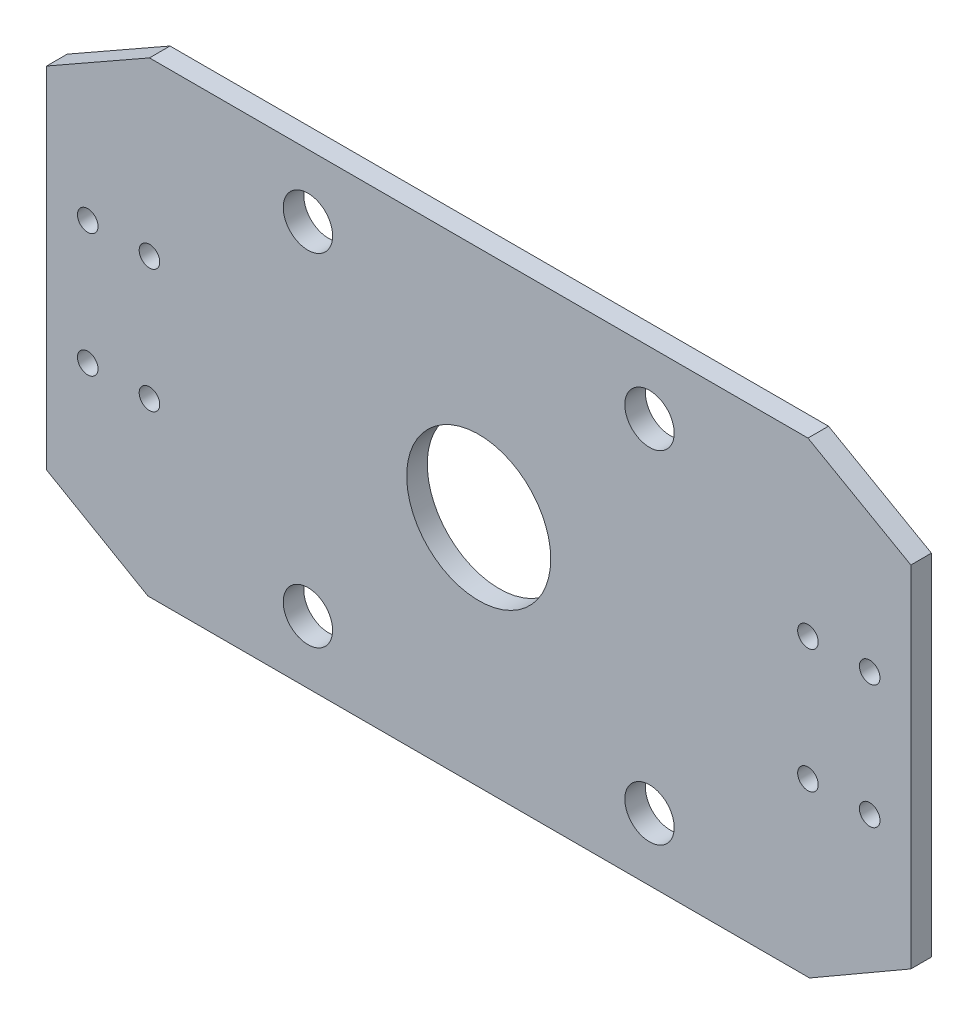
ISO-10303-21;
HEADER;
FILE_DESCRIPTION(('STEP AP214'),'2;1');
FILE_NAME('part.step','',(''),(''),'','','');
FILE_SCHEMA(('AUTOMOTIVE_DESIGN { 1 0 10303 214 1 1 1 1 }'));
ENDSEC;
DATA;
#1=APPLICATION_CONTEXT('core data for automotive mechanical design processes');
#2=APPLICATION_PROTOCOL_DEFINITION('international standard','automotive_design',2000,#1);
#3=PRODUCT_CONTEXT('',#1,'mechanical');
#4=PRODUCT('Part','Part','',(#3));
#5=PRODUCT_RELATED_PRODUCT_CATEGORY('part','',(#4));
#6=PRODUCT_DEFINITION_FORMATION('','',#4);
#7=PRODUCT_DEFINITION_CONTEXT('part definition',#1,'design');
#8=PRODUCT_DEFINITION('design','',#6,#7);
#9=PRODUCT_DEFINITION_SHAPE('','',#8);
#10=(LENGTH_UNIT() NAMED_UNIT(*) SI_UNIT(.MILLI.,.METRE.));
#11=(NAMED_UNIT(*) PLANE_ANGLE_UNIT() SI_UNIT($,.RADIAN.));
#12=(NAMED_UNIT(*) SI_UNIT($,.STERADIAN.) SOLID_ANGLE_UNIT());
#13=UNCERTAINTY_MEASURE_WITH_UNIT(LENGTH_MEASURE(1.E-05),#10,'distance_accuracy_value','');
#14=(GEOMETRIC_REPRESENTATION_CONTEXT(3) GLOBAL_UNCERTAINTY_ASSIGNED_CONTEXT((#13)) GLOBAL_UNIT_ASSIGNED_CONTEXT((#10,
#11,#12)) REPRESENTATION_CONTEXT('',''));
#15=CARTESIAN_POINT('',(0.,0.,0.));
#16=DIRECTION('',(0.,0.,1.));
#17=DIRECTION('',(1.,0.,0.));
#18=AXIS2_PLACEMENT_3D('',#15,#16,#17);
#19=CARTESIAN_POINT('',(0.,0.,5.));
#20=DIRECTION('',(0.,0.,1.));
#21=DIRECTION('',(1.,0.,0.));
#22=AXIS2_PLACEMENT_3D('',#19,#20,#21);
#23=PLANE('',#22);
#24=CARTESIAN_POINT('',(41.5000000000002,-42.4048530262646,5.));
#25=DIRECTION('',(0.,0.,1.));
#26=DIRECTION('',(1.,0.,0.));
#27=AXIS2_PLACEMENT_3D('',#24,#25,#26);
#28=CIRCLE('',#27,5.99999999999999);
#29=CARTESIAN_POINT('',(47.5000000000002,-42.4048530262646,5.));
#30=VERTEX_POINT('',#29);
#31=EDGE_CURVE('E242',#30,#30,#28,.T.);
#32=ORIENTED_EDGE('',*,*,#31,.F.);
#33=EDGE_LOOP('',(#32));
#34=FACE_BOUND('',#33,.T.);
#35=CARTESIAN_POINT('',(-41.4999999999998,40.5951469737354,5.));
#36=DIRECTION('',(0.,0.,1.));
#37=DIRECTION('',(1.,0.,0.));
#38=AXIS2_PLACEMENT_3D('',#35,#36,#37);
#39=CIRCLE('',#38,5.99999999999964);
#40=CARTESIAN_POINT('',(-35.5000000000001,40.5951469737354,5.));
#41=VERTEX_POINT('',#40);
#42=EDGE_CURVE('E230',#41,#41,#39,.T.);
#43=ORIENTED_EDGE('',*,*,#42,.F.);
#44=EDGE_LOOP('',(#43));
#45=FACE_BOUND('',#44,.T.);
#46=CARTESIAN_POINT('',(95.,14.0951469737353,5.));
#47=DIRECTION('',(0.,0.,1.));
#48=DIRECTION('',(-1.,0.,0.));
#49=AXIS2_PLACEMENT_3D('',#46,#47,#48);
#50=CIRCLE('',#49,2.49999999999986);
#51=CARTESIAN_POINT('',(92.5000000000001,14.0951469737353,5.));
#52=VERTEX_POINT('',#51);
#53=EDGE_CURVE('E218',#52,#52,#50,.T.);
#54=ORIENTED_EDGE('',*,*,#53,.F.);
#55=EDGE_LOOP('',(#54));
#56=FACE_BOUND('',#55,.T.);
#57=CARTESIAN_POINT('',(80.,-15.9048530262648,5.));
#58=DIRECTION('',(0.,0.,1.));
#59=DIRECTION('',(-1.,0.,0.));
#60=AXIS2_PLACEMENT_3D('',#57,#58,#59);
#61=CIRCLE('',#60,2.49999999999989);
#62=CARTESIAN_POINT('',(77.5000000000001,-15.9048530262648,5.));
#63=VERTEX_POINT('',#62);
#64=EDGE_CURVE('E206',#63,#63,#61,.T.);
#65=ORIENTED_EDGE('',*,*,#64,.F.);
#66=EDGE_LOOP('',(#65));
#67=FACE_BOUND('',#66,.T.);
#68=CARTESIAN_POINT('',(-95.,-15.9048530262648,5.));
#69=DIRECTION('',(0.,0.,1.));
#70=DIRECTION('',(1.,0.,0.));
#71=AXIS2_PLACEMENT_3D('',#68,#69,#70);
#72=CIRCLE('',#71,2.49999999999985);
#73=CARTESIAN_POINT('',(-92.5000000000002,-15.9048530262648,5.));
#74=VERTEX_POINT('',#73);
#75=EDGE_CURVE('E194',#74,#74,#72,.T.);
#76=ORIENTED_EDGE('',*,*,#75,.F.);
#77=EDGE_LOOP('',(#76));
#78=FACE_BOUND('',#77,.T.);
#79=CARTESIAN_POINT('',(0.,-0.904853026264963,5.));
#80=DIRECTION('',(0.,0.,1.));
#81=DIRECTION('',(1.,0.,0.));
#82=AXIS2_PLACEMENT_3D('',#79,#80,#81);
#83=CIRCLE('',#82,17.5);
#84=CARTESIAN_POINT('',(17.5,-0.904853026264963,5.));
#85=VERTEX_POINT('',#84);
#86=EDGE_CURVE('E182',#85,#85,#83,.T.);
#87=ORIENTED_EDGE('',*,*,#86,.F.);
#88=EDGE_LOOP('',(#87));
#89=FACE_BOUND('',#88,.T.);
#90=DIRECTION('',(-0.869347877682803,-0.494200634933229,0.));
#91=VECTOR('',#90,1.);
#92=CARTESIAN_POINT('',(-80.,55.8069673398957,5.));
#93=LINE('',#92,#91);
#94=CARTESIAN_POINT('',(-80.,55.8069673398957,5.));
#95=VERTEX_POINT('',#94);
#96=CARTESIAN_POINT('',(-105.,41.5951469737354,5.));
#97=VERTEX_POINT('',#96);
#98=EDGE_CURVE('E145',#95,#97,#93,.T.);
#99=ORIENTED_EDGE('',*,*,#98,.T.);
#100=DIRECTION('',(0.,-1.,0.));
#101=VECTOR('',#100,1.);
#102=CARTESIAN_POINT('',(-105.,41.5951469737354,5.));
#103=LINE('',#102,#101);
#104=CARTESIAN_POINT('',(-105.,-43.4048530262646,5.));
#105=VERTEX_POINT('',#104);
#106=EDGE_CURVE('E93',#97,#105,#103,.T.);
#107=ORIENTED_EDGE('',*,*,#106,.T.);
#108=DIRECTION('',(0.866025403784438,-0.5,0.));
#109=VECTOR('',#108,1.);
#110=CARTESIAN_POINT('',(-105.,-43.4048530262646,5.));
#111=LINE('',#110,#109);
#112=CARTESIAN_POINT('',(-80.3844050577675,-57.6166733924253,5.));
#113=VERTEX_POINT('',#112);
#114=EDGE_CURVE('E160',#105,#113,#111,.T.);
#115=ORIENTED_EDGE('',*,*,#114,.T.);
#116=DIRECTION('',(1.,0.,0.));
#117=VECTOR('',#116,1.);
#118=CARTESIAN_POINT('',(-80.3844050577675,-57.6166733924253,5.));
#119=LINE('',#118,#117);
#120=CARTESIAN_POINT('',(80.3844050577675,-57.6166733924253,5.));
#121=VERTEX_POINT('',#120);
#122=EDGE_CURVE('E173',#113,#121,#119,.T.);
#123=ORIENTED_EDGE('',*,*,#122,.T.);
#124=DIRECTION('',(0.866025403784439,0.499999999999999,0.));
#125=VECTOR('',#124,1.);
#126=CARTESIAN_POINT('',(105.,-43.4048530262646,5.));
#127=LINE('',#126,#125);
#128=CARTESIAN_POINT('',(105.,-43.4048530262646,5.));
#129=VERTEX_POINT('',#128);
#130=EDGE_CURVE('E112',#121,#129,#127,.T.);
#131=ORIENTED_EDGE('',*,*,#130,.T.);
#132=DIRECTION('',(0.,1.,0.));
#133=VECTOR('',#132,1.);
#134=CARTESIAN_POINT('',(105.,41.5951469737354,5.));
#135=LINE('',#134,#133);
#136=CARTESIAN_POINT('',(105.,41.5951469737354,5.));
#137=VERTEX_POINT('',#136);
#138=EDGE_CURVE('E106',#129,#137,#135,.T.);
#139=ORIENTED_EDGE('',*,*,#138,.T.);
#140=DIRECTION('',(-0.869347877682803,0.494200634933228,0.));
#141=VECTOR('',#140,1.);
#142=CARTESIAN_POINT('',(80.,55.8069673398957,5.));
#143=LINE('',#142,#141);
#144=CARTESIAN_POINT('',(80.,55.8069673398957,5.));
#145=VERTEX_POINT('',#144);
#146=EDGE_CURVE('E110',#137,#145,#143,.T.);
#147=ORIENTED_EDGE('',*,*,#146,.T.);
#148=DIRECTION('',(-1.,0.,0.));
#149=VECTOR('',#148,1.);
#150=CARTESIAN_POINT('',(80.,55.8069673398957,5.));
#151=LINE('',#150,#149);
#152=EDGE_CURVE('E50',#145,#95,#151,.T.);
#153=ORIENTED_EDGE('',*,*,#152,.T.);
#154=EDGE_LOOP('',(#99,#107,#115,#123,#131,#139,#147,#153));
#155=FACE_BOUND('',#154,.T.);
#156=CARTESIAN_POINT('',(-95.,14.0951469737352,5.));
#157=DIRECTION('',(0.,0.,1.));
#158=DIRECTION('',(1.,0.,0.));
#159=AXIS2_PLACEMENT_3D('',#156,#157,#158);
#160=CIRCLE('',#159,2.49999999999986);
#161=CARTESIAN_POINT('',(-92.5000000000001,14.0951469737352,5.));
#162=VERTEX_POINT('',#161);
#163=EDGE_CURVE('E134',#162,#162,#160,.T.);
#164=ORIENTED_EDGE('',*,*,#163,.F.);
#165=EDGE_LOOP('',(#164));
#166=FACE_BOUND('',#165,.T.);
#167=CARTESIAN_POINT('',(-80.,14.0951469737352,5.));
#168=DIRECTION('',(0.,0.,1.));
#169=DIRECTION('',(1.,0.,0.));
#170=AXIS2_PLACEMENT_3D('',#167,#168,#169);
#171=CIRCLE('',#170,2.49999999999986);
#172=CARTESIAN_POINT('',(-77.5000000000001,14.0951469737352,5.));
#173=VERTEX_POINT('',#172);
#174=EDGE_CURVE('E188',#173,#173,#171,.T.);
#175=ORIENTED_EDGE('',*,*,#174,.F.);
#176=EDGE_LOOP('',(#175));
#177=FACE_BOUND('',#176,.T.);
#178=CARTESIAN_POINT('',(-80.,-15.9048530262648,5.));
#179=DIRECTION('',(0.,0.,1.));
#180=DIRECTION('',(1.,0.,0.));
#181=AXIS2_PLACEMENT_3D('',#178,#179,#180);
#182=CIRCLE('',#181,2.49999999999986);
#183=CARTESIAN_POINT('',(-77.5000000000001,-15.9048530262648,5.));
#184=VERTEX_POINT('',#183);
#185=EDGE_CURVE('E200',#184,#184,#182,.T.);
#186=ORIENTED_EDGE('',*,*,#185,.F.);
#187=EDGE_LOOP('',(#186));
#188=FACE_BOUND('',#187,.T.);
#189=CARTESIAN_POINT('',(95.,-15.9048530262647,5.));
#190=DIRECTION('',(0.,0.,1.));
#191=DIRECTION('',(-1.,0.,0.));
#192=AXIS2_PLACEMENT_3D('',#189,#190,#191);
#193=CIRCLE('',#192,2.49999999999988);
#194=CARTESIAN_POINT('',(92.5000000000002,-15.9048530262647,5.));
#195=VERTEX_POINT('',#194);
#196=EDGE_CURVE('E212',#195,#195,#193,.T.);
#197=ORIENTED_EDGE('',*,*,#196,.F.);
#198=EDGE_LOOP('',(#197));
#199=FACE_BOUND('',#198,.T.);
#200=CARTESIAN_POINT('',(80.,14.0951469737352,5.));
#201=DIRECTION('',(0.,0.,1.));
#202=DIRECTION('',(-1.,0.,0.));
#203=AXIS2_PLACEMENT_3D('',#200,#201,#202);
#204=CIRCLE('',#203,2.49999999999989);
#205=CARTESIAN_POINT('',(77.5000000000001,14.0951469737352,5.));
#206=VERTEX_POINT('',#205);
#207=EDGE_CURVE('E224',#206,#206,#204,.T.);
#208=ORIENTED_EDGE('',*,*,#207,.F.);
#209=EDGE_LOOP('',(#208));
#210=FACE_BOUND('',#209,.T.);
#211=CARTESIAN_POINT('',(41.5000000000002,40.5951469737354,5.));
#212=DIRECTION('',(0.,0.,1.));
#213=DIRECTION('',(1.,0.,0.));
#214=AXIS2_PLACEMENT_3D('',#211,#212,#213);
#215=CIRCLE('',#214,5.99999999999999);
#216=CARTESIAN_POINT('',(47.5000000000002,40.5951469737354,5.));
#217=VERTEX_POINT('',#216);
#218=EDGE_CURVE('E236',#217,#217,#215,.T.);
#219=ORIENTED_EDGE('',*,*,#218,.F.);
#220=EDGE_LOOP('',(#219));
#221=FACE_BOUND('',#220,.T.);
#222=CARTESIAN_POINT('',(-41.4999999999998,-42.4048530262646,5.));
#223=DIRECTION('',(0.,0.,1.));
#224=DIRECTION('',(1.,0.,0.));
#225=AXIS2_PLACEMENT_3D('',#222,#223,#224);
#226=CIRCLE('',#225,5.99999999999999);
#227=CARTESIAN_POINT('',(-35.4999999999998,-42.4048530262646,5.));
#228=VERTEX_POINT('',#227);
#229=EDGE_CURVE('E248',#228,#228,#226,.T.);
#230=ORIENTED_EDGE('',*,*,#229,.F.);
#231=EDGE_LOOP('',(#230));
#232=FACE_BOUND('',#231,.T.);
#233=ADVANCED_FACE('F33',(#34,#45,#56,#67,#78,#89,#155,#166,#177,#188,#199,#210,#221,#232),#23,.T.);
#234=CARTESIAN_POINT('',(0.,0.,0.));
#235=DIRECTION('',(0.,0.,1.));
#236=DIRECTION('',(1.,0.,0.));
#237=AXIS2_PLACEMENT_3D('',#234,#235,#236);
#238=PLANE('',#237);
#239=DIRECTION('',(-0.869347877682803,-0.494200634933229,0.));
#240=VECTOR('',#239,1.);
#241=CARTESIAN_POINT('',(-80.,55.8069673398957,0.));
#242=LINE('',#241,#240);
#243=CARTESIAN_POINT('',(-80.,55.8069673398957,0.));
#244=VERTEX_POINT('',#243);
#245=CARTESIAN_POINT('',(-105.,41.5951469737354,0.));
#246=VERTEX_POINT('',#245);
#247=EDGE_CURVE('E130',#244,#246,#242,.T.);
#248=ORIENTED_EDGE('',*,*,#247,.F.);
#249=DIRECTION('',(-1.,0.,0.));
#250=VECTOR('',#249,1.);
#251=CARTESIAN_POINT('',(80.,55.8069673398957,0.));
#252=LINE('',#251,#250);
#253=CARTESIAN_POINT('',(80.,55.8069673398957,0.));
#254=VERTEX_POINT('',#253);
#255=EDGE_CURVE('E85',#254,#244,#252,.T.);
#256=ORIENTED_EDGE('',*,*,#255,.F.);
#257=DIRECTION('',(-0.869347877682803,0.494200634933228,0.));
#258=VECTOR('',#257,1.);
#259=CARTESIAN_POINT('',(80.,55.8069673398957,0.));
#260=LINE('',#259,#258);
#261=CARTESIAN_POINT('',(105.,41.5951469737354,0.));
#262=VERTEX_POINT('',#261);
#263=EDGE_CURVE('E79',#262,#254,#260,.T.);
#264=ORIENTED_EDGE('',*,*,#263,.F.);
#265=DIRECTION('',(0.,1.,0.));
#266=VECTOR('',#265,1.);
#267=CARTESIAN_POINT('',(105.,41.5951469737354,0.));
#268=LINE('',#267,#266);
#269=CARTESIAN_POINT('',(105.,-43.4048530262646,0.));
#270=VERTEX_POINT('',#269);
#271=EDGE_CURVE('E120',#270,#262,#268,.T.);
#272=ORIENTED_EDGE('',*,*,#271,.F.);
#273=DIRECTION('',(0.866025403784439,0.499999999999999,0.));
#274=VECTOR('',#273,1.);
#275=CARTESIAN_POINT('',(105.,-43.4048530262646,0.));
#276=LINE('',#275,#274);
#277=CARTESIAN_POINT('',(80.3844050577675,-57.6166733924253,0.));
#278=VERTEX_POINT('',#277);
#279=EDGE_CURVE('E140',#278,#270,#276,.T.);
#280=ORIENTED_EDGE('',*,*,#279,.F.);
#281=DIRECTION('',(1.,0.,0.));
#282=VECTOR('',#281,1.);
#283=CARTESIAN_POINT('',(-80.3844050577675,-57.6166733924253,0.));
#284=LINE('',#283,#282);
#285=CARTESIAN_POINT('',(-80.3844050577675,-57.6166733924253,0.));
#286=VERTEX_POINT('',#285);
#287=EDGE_CURVE('E138',#286,#278,#284,.T.);
#288=ORIENTED_EDGE('',*,*,#287,.F.);
#289=DIRECTION('',(0.866025403784438,-0.5,0.));
#290=VECTOR('',#289,1.);
#291=CARTESIAN_POINT('',(-105.,-43.4048530262646,0.));
#292=LINE('',#291,#290);
#293=CARTESIAN_POINT('',(-105.,-43.4048530262646,0.));
#294=VERTEX_POINT('',#293);
#295=EDGE_CURVE('E136',#294,#286,#292,.T.);
#296=ORIENTED_EDGE('',*,*,#295,.F.);
#297=DIRECTION('',(0.,-1.,0.));
#298=VECTOR('',#297,1.);
#299=CARTESIAN_POINT('',(-105.,41.5951469737354,0.));
#300=LINE('',#299,#298);
#301=EDGE_CURVE('E133',#246,#294,#300,.T.);
#302=ORIENTED_EDGE('',*,*,#301,.F.);
#303=EDGE_LOOP('',(#248,#256,#264,#272,#280,#288,#296,#302));
#304=FACE_BOUND('',#303,.T.);
#305=CARTESIAN_POINT('',(-95.,14.0951469737352,0.));
#306=DIRECTION('',(0.,0.,1.));
#307=DIRECTION('',(1.,0.,0.));
#308=AXIS2_PLACEMENT_3D('',#305,#306,#307);
#309=CIRCLE('',#308,2.49999999999986);
#310=CARTESIAN_POINT('',(-92.5000000000001,14.0951469737352,0.));
#311=VERTEX_POINT('',#310);
#312=EDGE_CURVE('E179',#311,#311,#309,.T.);
#313=ORIENTED_EDGE('',*,*,#312,.T.);
#314=EDGE_LOOP('',(#313));
#315=FACE_BOUND('',#314,.T.);
#316=CARTESIAN_POINT('',(0.,-0.904853026264963,0.));
#317=DIRECTION('',(0.,0.,1.));
#318=DIRECTION('',(1.,0.,0.));
#319=AXIS2_PLACEMENT_3D('',#316,#317,#318);
#320=CIRCLE('',#319,17.5);
#321=CARTESIAN_POINT('',(17.5,-0.904853026264963,0.));
#322=VERTEX_POINT('',#321);
#323=EDGE_CURVE('E185',#322,#322,#320,.T.);
#324=ORIENTED_EDGE('',*,*,#323,.T.);
#325=EDGE_LOOP('',(#324));
#326=FACE_BOUND('',#325,.T.);
#327=CARTESIAN_POINT('',(-80.,14.0951469737352,0.));
#328=DIRECTION('',(0.,0.,1.));
#329=DIRECTION('',(1.,0.,0.));
#330=AXIS2_PLACEMENT_3D('',#327,#328,#329);
#331=CIRCLE('',#330,2.49999999999986);
#332=CARTESIAN_POINT('',(-77.5000000000001,14.0951469737352,0.));
#333=VERTEX_POINT('',#332);
#334=EDGE_CURVE('E191',#333,#333,#331,.T.);
#335=ORIENTED_EDGE('',*,*,#334,.T.);
#336=EDGE_LOOP('',(#335));
#337=FACE_BOUND('',#336,.T.);
#338=CARTESIAN_POINT('',(-95.,-15.9048530262648,0.));
#339=DIRECTION('',(0.,0.,1.));
#340=DIRECTION('',(1.,0.,0.));
#341=AXIS2_PLACEMENT_3D('',#338,#339,#340);
#342=CIRCLE('',#341,2.49999999999985);
#343=CARTESIAN_POINT('',(-92.5000000000002,-15.9048530262648,0.));
#344=VERTEX_POINT('',#343);
#345=EDGE_CURVE('E197',#344,#344,#342,.T.);
#346=ORIENTED_EDGE('',*,*,#345,.T.);
#347=EDGE_LOOP('',(#346));
#348=FACE_BOUND('',#347,.T.);
#349=CARTESIAN_POINT('',(-80.,-15.9048530262648,0.));
#350=DIRECTION('',(0.,0.,1.));
#351=DIRECTION('',(1.,0.,0.));
#352=AXIS2_PLACEMENT_3D('',#349,#350,#351);
#353=CIRCLE('',#352,2.49999999999986);
#354=CARTESIAN_POINT('',(-77.5000000000001,-15.9048530262648,0.));
#355=VERTEX_POINT('',#354);
#356=EDGE_CURVE('E203',#355,#355,#353,.T.);
#357=ORIENTED_EDGE('',*,*,#356,.T.);
#358=EDGE_LOOP('',(#357));
#359=FACE_BOUND('',#358,.T.);
#360=CARTESIAN_POINT('',(80.,-15.9048530262648,0.));
#361=DIRECTION('',(0.,0.,1.));
#362=DIRECTION('',(-1.,0.,0.));
#363=AXIS2_PLACEMENT_3D('',#360,#361,#362);
#364=CIRCLE('',#363,2.49999999999989);
#365=CARTESIAN_POINT('',(77.5000000000001,-15.9048530262648,0.));
#366=VERTEX_POINT('',#365);
#367=EDGE_CURVE('E209',#366,#366,#364,.T.);
#368=ORIENTED_EDGE('',*,*,#367,.T.);
#369=EDGE_LOOP('',(#368));
#370=FACE_BOUND('',#369,.T.);
#371=CARTESIAN_POINT('',(95.,-15.9048530262647,0.));
#372=DIRECTION('',(0.,0.,1.));
#373=DIRECTION('',(-1.,0.,0.));
#374=AXIS2_PLACEMENT_3D('',#371,#372,#373);
#375=CIRCLE('',#374,2.49999999999988);
#376=CARTESIAN_POINT('',(92.5000000000002,-15.9048530262647,0.));
#377=VERTEX_POINT('',#376);
#378=EDGE_CURVE('E215',#377,#377,#375,.T.);
#379=ORIENTED_EDGE('',*,*,#378,.T.);
#380=EDGE_LOOP('',(#379));
#381=FACE_BOUND('',#380,.T.);
#382=CARTESIAN_POINT('',(95.,14.0951469737353,0.));
#383=DIRECTION('',(0.,0.,1.));
#384=DIRECTION('',(-1.,0.,0.));
#385=AXIS2_PLACEMENT_3D('',#382,#383,#384);
#386=CIRCLE('',#385,2.49999999999986);
#387=CARTESIAN_POINT('',(92.5000000000001,14.0951469737353,0.));
#388=VERTEX_POINT('',#387);
#389=EDGE_CURVE('E221',#388,#388,#386,.T.);
#390=ORIENTED_EDGE('',*,*,#389,.T.);
#391=EDGE_LOOP('',(#390));
#392=FACE_BOUND('',#391,.T.);
#393=CARTESIAN_POINT('',(80.,14.0951469737352,0.));
#394=DIRECTION('',(0.,0.,1.));
#395=DIRECTION('',(-1.,0.,0.));
#396=AXIS2_PLACEMENT_3D('',#393,#394,#395);
#397=CIRCLE('',#396,2.49999999999989);
#398=CARTESIAN_POINT('',(77.5000000000001,14.0951469737352,0.));
#399=VERTEX_POINT('',#398);
#400=EDGE_CURVE('E227',#399,#399,#397,.T.);
#401=ORIENTED_EDGE('',*,*,#400,.T.);
#402=EDGE_LOOP('',(#401));
#403=FACE_BOUND('',#402,.T.);
#404=CARTESIAN_POINT('',(-41.4999999999998,40.5951469737354,0.));
#405=DIRECTION('',(0.,0.,1.));
#406=DIRECTION('',(1.,0.,0.));
#407=AXIS2_PLACEMENT_3D('',#404,#405,#406);
#408=CIRCLE('',#407,5.99999999999964);
#409=CARTESIAN_POINT('',(-35.5000000000001,40.5951469737354,0.));
#410=VERTEX_POINT('',#409);
#411=EDGE_CURVE('E233',#410,#410,#408,.T.);
#412=ORIENTED_EDGE('',*,*,#411,.T.);
#413=EDGE_LOOP('',(#412));
#414=FACE_BOUND('',#413,.T.);
#415=CARTESIAN_POINT('',(41.5000000000002,40.5951469737354,0.));
#416=DIRECTION('',(0.,0.,1.));
#417=DIRECTION('',(1.,0.,0.));
#418=AXIS2_PLACEMENT_3D('',#415,#416,#417);
#419=CIRCLE('',#418,5.99999999999999);
#420=CARTESIAN_POINT('',(47.5000000000002,40.5951469737354,0.));
#421=VERTEX_POINT('',#420);
#422=EDGE_CURVE('E239',#421,#421,#419,.T.);
#423=ORIENTED_EDGE('',*,*,#422,.T.);
#424=EDGE_LOOP('',(#423));
#425=FACE_BOUND('',#424,.T.);
#426=CARTESIAN_POINT('',(41.5000000000002,-42.4048530262646,0.));
#427=DIRECTION('',(0.,0.,1.));
#428=DIRECTION('',(1.,0.,0.));
#429=AXIS2_PLACEMENT_3D('',#426,#427,#428);
#430=CIRCLE('',#429,5.99999999999999);
#431=CARTESIAN_POINT('',(47.5000000000002,-42.4048530262646,0.));
#432=VERTEX_POINT('',#431);
#433=EDGE_CURVE('E245',#432,#432,#430,.T.);
#434=ORIENTED_EDGE('',*,*,#433,.T.);
#435=EDGE_LOOP('',(#434));
#436=FACE_BOUND('',#435,.T.);
#437=CARTESIAN_POINT('',(-41.4999999999998,-42.4048530262646,0.));
#438=DIRECTION('',(0.,0.,1.));
#439=DIRECTION('',(1.,0.,0.));
#440=AXIS2_PLACEMENT_3D('',#437,#438,#439);
#441=CIRCLE('',#440,5.99999999999999);
#442=CARTESIAN_POINT('',(-35.4999999999998,-42.4048530262646,0.));
#443=VERTEX_POINT('',#442);
#444=EDGE_CURVE('E251',#443,#443,#441,.T.);
#445=ORIENTED_EDGE('',*,*,#444,.T.);
#446=EDGE_LOOP('',(#445));
#447=FACE_BOUND('',#446,.T.);
#448=ADVANCED_FACE('F164',(#304,#315,#326,#337,#348,#359,#370,#381,#392,#403,#414,#425,#436,
#447),#238,.F.);
#449=CARTESIAN_POINT('',(-80.,55.8069673398957,5.));
#450=DIRECTION('',(0.494200634933228,-0.869347877682803,0.));
#451=DIRECTION('',(0.869347877682803,0.494200634933228,0.));
#452=AXIS2_PLACEMENT_3D('',#449,#450,#451);
#453=PLANE('',#452);
#454=ORIENTED_EDGE('',*,*,#247,.T.);
#455=DIRECTION('',(0.,0.,-1.));
#456=VECTOR('',#455,1.);
#457=CARTESIAN_POINT('',(-105.,41.5951469737354,5.));
#458=LINE('',#457,#456);
#459=EDGE_CURVE('E11',#97,#246,#458,.T.);
#460=ORIENTED_EDGE('',*,*,#459,.F.);
#461=ORIENTED_EDGE('',*,*,#98,.F.);
#462=DIRECTION('',(0.,0.,-1.));
#463=VECTOR('',#462,1.);
#464=CARTESIAN_POINT('',(-80.,55.8069673398957,5.));
#465=LINE('',#464,#463);
#466=EDGE_CURVE('E126',#95,#244,#465,.T.);
#467=ORIENTED_EDGE('',*,*,#466,.T.);
#468=EDGE_LOOP('',(#454,#460,#461,#467));
#469=FACE_BOUND('',#468,.T.);
#470=ADVANCED_FACE('F35',(#469),#453,.F.);
#471=CARTESIAN_POINT('',(-105.,41.5951469737354,5.));
#472=DIRECTION('',(1.,0.,0.));
#473=DIRECTION('',(0.,0.,-1.));
#474=AXIS2_PLACEMENT_3D('',#471,#472,#473);
#475=PLANE('',#474);
#476=ORIENTED_EDGE('',*,*,#301,.T.);
#477=DIRECTION('',(0.,0.,-1.));
#478=VECTOR('',#477,1.);
#479=CARTESIAN_POINT('',(-105.,-43.4048530262646,5.));
#480=LINE('',#479,#478);
#481=EDGE_CURVE('E42',#105,#294,#480,.T.);
#482=ORIENTED_EDGE('',*,*,#481,.F.);
#483=ORIENTED_EDGE('',*,*,#106,.F.);
#484=ORIENTED_EDGE('',*,*,#459,.T.);
#485=EDGE_LOOP('',(#476,#482,#483,#484));
#486=FACE_BOUND('',#485,.T.);
#487=ADVANCED_FACE('F285',(#486),#475,.F.);
#488=CARTESIAN_POINT('',(-105.,-43.4048530262646,5.));
#489=DIRECTION('',(0.5,0.866025403784438,0.));
#490=DIRECTION('',(-0.866025403784438,0.5,0.));
#491=AXIS2_PLACEMENT_3D('',#488,#489,#490);
#492=PLANE('',#491);
#493=ORIENTED_EDGE('',*,*,#295,.T.);
#494=DIRECTION('',(0.,0.,-1.));
#495=VECTOR('',#494,1.);
#496=CARTESIAN_POINT('',(-80.3844050577675,-57.6166733924253,5.));
#497=LINE('',#496,#495);
#498=EDGE_CURVE('E152',#113,#286,#497,.T.);
#499=ORIENTED_EDGE('',*,*,#498,.F.);
#500=ORIENTED_EDGE('',*,*,#114,.F.);
#501=ORIENTED_EDGE('',*,*,#481,.T.);
#502=EDGE_LOOP('',(#493,#499,#500,#501));
#503=FACE_BOUND('',#502,.T.);
#504=ADVANCED_FACE('F158',(#503),#492,.F.);
#505=CARTESIAN_POINT('',(-80.3844050577675,-57.6166733924253,5.));
#506=DIRECTION('',(0.,1.,0.));
#507=DIRECTION('',(-1.,0.,0.));
#508=AXIS2_PLACEMENT_3D('',#505,#506,#507);
#509=PLANE('',#508);
#510=ORIENTED_EDGE('',*,*,#287,.T.);
#511=DIRECTION('',(0.,0.,-1.));
#512=VECTOR('',#511,1.);
#513=CARTESIAN_POINT('',(80.3844050577675,-57.6166733924253,5.));
#514=LINE('',#513,#512);
#515=EDGE_CURVE('E149',#121,#278,#514,.T.);
#516=ORIENTED_EDGE('',*,*,#515,.F.);
#517=ORIENTED_EDGE('',*,*,#122,.F.);
#518=ORIENTED_EDGE('',*,*,#498,.T.);
#519=EDGE_LOOP('',(#510,#516,#517,#518));
#520=FACE_BOUND('',#519,.T.);
#521=ADVANCED_FACE('F169',(#520),#509,.F.);
#522=CARTESIAN_POINT('',(105.,-43.4048530262646,5.));
#523=DIRECTION('',(-0.5,0.866025403784439,0.));
#524=DIRECTION('',(-0.866025403784439,-0.5,0.));
#525=AXIS2_PLACEMENT_3D('',#522,#523,#524);
#526=PLANE('',#525);
#527=ORIENTED_EDGE('',*,*,#279,.T.);
#528=DIRECTION('',(0.,0.,-1.));
#529=VECTOR('',#528,1.);
#530=CARTESIAN_POINT('',(105.,-43.4048530262646,5.));
#531=LINE('',#530,#529);
#532=EDGE_CURVE('E121',#129,#270,#531,.T.);
#533=ORIENTED_EDGE('',*,*,#532,.F.);
#534=ORIENTED_EDGE('',*,*,#130,.F.);
#535=ORIENTED_EDGE('',*,*,#515,.T.);
#536=EDGE_LOOP('',(#527,#533,#534,#535));
#537=FACE_BOUND('',#536,.T.);
#538=ADVANCED_FACE('F172',(#537),#526,.F.);
#539=CARTESIAN_POINT('',(105.,41.5951469737354,5.));
#540=DIRECTION('',(-1.,0.,0.));
#541=DIRECTION('',(0.,0.,1.));
#542=AXIS2_PLACEMENT_3D('',#539,#540,#541);
#543=PLANE('',#542);
#544=ORIENTED_EDGE('',*,*,#271,.T.);
#545=DIRECTION('',(0.,0.,-1.));
#546=VECTOR('',#545,1.);
#547=CARTESIAN_POINT('',(105.,41.5951469737354,5.));
#548=LINE('',#547,#546);
#549=EDGE_CURVE('E117',#137,#262,#548,.T.);
#550=ORIENTED_EDGE('',*,*,#549,.F.);
#551=ORIENTED_EDGE('',*,*,#138,.F.);
#552=ORIENTED_EDGE('',*,*,#532,.T.);
#553=EDGE_LOOP('',(#544,#550,#551,#552));
#554=FACE_BOUND('',#553,.T.);
#555=ADVANCED_FACE('F118',(#554),#543,.F.);
#556=CARTESIAN_POINT('',(80.,55.8069673398957,5.));
#557=DIRECTION('',(-0.494200634933228,-0.869347877682803,0.));
#558=DIRECTION('',(0.869347877682803,-0.494200634933228,0.));
#559=AXIS2_PLACEMENT_3D('',#556,#557,#558);
#560=PLANE('',#559);
#561=ORIENTED_EDGE('',*,*,#263,.T.);
#562=DIRECTION('',(0.,0.,-1.));
#563=VECTOR('',#562,1.);
#564=CARTESIAN_POINT('',(80.,55.8069673398957,5.));
#565=LINE('',#564,#563);
#566=EDGE_CURVE('E122',#145,#254,#565,.T.);
#567=ORIENTED_EDGE('',*,*,#566,.F.);
#568=ORIENTED_EDGE('',*,*,#146,.F.);
#569=ORIENTED_EDGE('',*,*,#549,.T.);
#570=EDGE_LOOP('',(#561,#567,#568,#569));
#571=FACE_BOUND('',#570,.T.);
#572=ADVANCED_FACE('F124',(#571),#560,.F.);
#573=CARTESIAN_POINT('',(80.,55.8069673398957,5.));
#574=DIRECTION('',(0.,-1.,0.));
#575=DIRECTION('',(1.,0.,0.));
#576=AXIS2_PLACEMENT_3D('',#573,#574,#575);
#577=PLANE('',#576);
#578=ORIENTED_EDGE('',*,*,#255,.T.);
#579=ORIENTED_EDGE('',*,*,#466,.F.);
#580=ORIENTED_EDGE('',*,*,#152,.F.);
#581=ORIENTED_EDGE('',*,*,#566,.T.);
#582=EDGE_LOOP('',(#578,#579,#580,#581));
#583=FACE_BOUND('',#582,.T.);
#584=ADVANCED_FACE('F273',(#583),#577,.F.);
#585=CARTESIAN_POINT('',(-95.,14.0951469737352,5.));
#586=DIRECTION('',(0.,0.,-1.));
#587=DIRECTION('',(-1.,0.,0.));
#588=AXIS2_PLACEMENT_3D('',#585,#586,#587);
#589=CYLINDRICAL_SURFACE('',#588,2.49999999999986);
#590=ORIENTED_EDGE('',*,*,#163,.T.);
#591=EDGE_LOOP('',(#590));
#592=FACE_BOUND('',#591,.T.);
#593=ORIENTED_EDGE('',*,*,#312,.F.);
#594=EDGE_LOOP('',(#593));
#595=FACE_BOUND('',#594,.T.);
#596=ADVANCED_FACE('F270',(#592,#595),#589,.F.);
#597=CARTESIAN_POINT('',(0.,-0.904853026264963,5.));
#598=DIRECTION('',(0.,0.,-1.));
#599=DIRECTION('',(-1.,0.,0.));
#600=AXIS2_PLACEMENT_3D('',#597,#598,#599);
#601=CYLINDRICAL_SURFACE('',#600,17.5);
#602=ORIENTED_EDGE('',*,*,#86,.T.);
#603=EDGE_LOOP('',(#602));
#604=FACE_BOUND('',#603,.T.);
#605=ORIENTED_EDGE('',*,*,#323,.F.);
#606=EDGE_LOOP('',(#605));
#607=FACE_BOUND('',#606,.T.);
#608=ADVANCED_FACE('F349',(#604,#607),#601,.F.);
#609=CARTESIAN_POINT('',(-80.,14.0951469737352,5.));
#610=DIRECTION('',(0.,0.,-1.));
#611=DIRECTION('',(-1.,0.,0.));
#612=AXIS2_PLACEMENT_3D('',#609,#610,#611);
#613=CYLINDRICAL_SURFACE('',#612,2.49999999999986);
#614=ORIENTED_EDGE('',*,*,#174,.T.);
#615=EDGE_LOOP('',(#614));
#616=FACE_BOUND('',#615,.T.);
#617=ORIENTED_EDGE('',*,*,#334,.F.);
#618=EDGE_LOOP('',(#617));
#619=FACE_BOUND('',#618,.T.);
#620=ADVANCED_FACE('F357',(#616,#619),#613,.F.);
#621=CARTESIAN_POINT('',(-95.,-15.9048530262648,5.));
#622=DIRECTION('',(0.,0.,-1.));
#623=DIRECTION('',(-1.,0.,0.));
#624=AXIS2_PLACEMENT_3D('',#621,#622,#623);
#625=CYLINDRICAL_SURFACE('',#624,2.49999999999985);
#626=ORIENTED_EDGE('',*,*,#75,.T.);
#627=EDGE_LOOP('',(#626));
#628=FACE_BOUND('',#627,.T.);
#629=ORIENTED_EDGE('',*,*,#345,.F.);
#630=EDGE_LOOP('',(#629));
#631=FACE_BOUND('',#630,.T.);
#632=ADVANCED_FACE('F365',(#628,#631),#625,.F.);
#633=CARTESIAN_POINT('',(-80.,-15.9048530262648,5.));
#634=DIRECTION('',(0.,0.,-1.));
#635=DIRECTION('',(-1.,0.,0.));
#636=AXIS2_PLACEMENT_3D('',#633,#634,#635);
#637=CYLINDRICAL_SURFACE('',#636,2.49999999999986);
#638=ORIENTED_EDGE('',*,*,#185,.T.);
#639=EDGE_LOOP('',(#638));
#640=FACE_BOUND('',#639,.T.);
#641=ORIENTED_EDGE('',*,*,#356,.F.);
#642=EDGE_LOOP('',(#641));
#643=FACE_BOUND('',#642,.T.);
#644=ADVANCED_FACE('F374',(#640,#643),#637,.F.);
#645=CARTESIAN_POINT('',(80.,-15.9048530262648,5.));
#646=DIRECTION('',(0.,0.,-1.));
#647=DIRECTION('',(-1.,0.,0.));
#648=AXIS2_PLACEMENT_3D('',#645,#646,#647);
#649=CYLINDRICAL_SURFACE('',#648,2.49999999999989);
#650=ORIENTED_EDGE('',*,*,#64,.T.);
#651=EDGE_LOOP('',(#650));
#652=FACE_BOUND('',#651,.T.);
#653=ORIENTED_EDGE('',*,*,#367,.F.);
#654=EDGE_LOOP('',(#653));
#655=FACE_BOUND('',#654,.T.);
#656=ADVANCED_FACE('F383',(#652,#655),#649,.F.);
#657=CARTESIAN_POINT('',(95.,-15.9048530262647,5.));
#658=DIRECTION('',(0.,0.,-1.));
#659=DIRECTION('',(-1.,0.,0.));
#660=AXIS2_PLACEMENT_3D('',#657,#658,#659);
#661=CYLINDRICAL_SURFACE('',#660,2.49999999999988);
#662=ORIENTED_EDGE('',*,*,#196,.T.);
#663=EDGE_LOOP('',(#662));
#664=FACE_BOUND('',#663,.T.);
#665=ORIENTED_EDGE('',*,*,#378,.F.);
#666=EDGE_LOOP('',(#665));
#667=FACE_BOUND('',#666,.T.);
#668=ADVANCED_FACE('F392',(#664,#667),#661,.F.);
#669=CARTESIAN_POINT('',(95.,14.0951469737353,5.));
#670=DIRECTION('',(0.,0.,-1.));
#671=DIRECTION('',(-1.,0.,0.));
#672=AXIS2_PLACEMENT_3D('',#669,#670,#671);
#673=CYLINDRICAL_SURFACE('',#672,2.49999999999986);
#674=ORIENTED_EDGE('',*,*,#53,.T.);
#675=EDGE_LOOP('',(#674));
#676=FACE_BOUND('',#675,.T.);
#677=ORIENTED_EDGE('',*,*,#389,.F.);
#678=EDGE_LOOP('',(#677));
#679=FACE_BOUND('',#678,.T.);
#680=ADVANCED_FACE('F401',(#676,#679),#673,.F.);
#681=CARTESIAN_POINT('',(80.,14.0951469737352,5.));
#682=DIRECTION('',(0.,0.,-1.));
#683=DIRECTION('',(-1.,0.,0.));
#684=AXIS2_PLACEMENT_3D('',#681,#682,#683);
#685=CYLINDRICAL_SURFACE('',#684,2.49999999999989);
#686=ORIENTED_EDGE('',*,*,#207,.T.);
#687=EDGE_LOOP('',(#686));
#688=FACE_BOUND('',#687,.T.);
#689=ORIENTED_EDGE('',*,*,#400,.F.);
#690=EDGE_LOOP('',(#689));
#691=FACE_BOUND('',#690,.T.);
#692=ADVANCED_FACE('F410',(#688,#691),#685,.F.);
#693=CARTESIAN_POINT('',(-41.4999999999998,40.5951469737354,5.));
#694=DIRECTION('',(0.,0.,-1.));
#695=DIRECTION('',(-1.,0.,0.));
#696=AXIS2_PLACEMENT_3D('',#693,#694,#695);
#697=CYLINDRICAL_SURFACE('',#696,5.99999999999964);
#698=ORIENTED_EDGE('',*,*,#42,.T.);
#699=EDGE_LOOP('',(#698));
#700=FACE_BOUND('',#699,.T.);
#701=ORIENTED_EDGE('',*,*,#411,.F.);
#702=EDGE_LOOP('',(#701));
#703=FACE_BOUND('',#702,.T.);
#704=ADVANCED_FACE('F419',(#700,#703),#697,.F.);
#705=CARTESIAN_POINT('',(41.5000000000002,40.5951469737354,5.));
#706=DIRECTION('',(0.,0.,-1.));
#707=DIRECTION('',(-1.,0.,0.));
#708=AXIS2_PLACEMENT_3D('',#705,#706,#707);
#709=CYLINDRICAL_SURFACE('',#708,5.99999999999999);
#710=ORIENTED_EDGE('',*,*,#218,.T.);
#711=EDGE_LOOP('',(#710));
#712=FACE_BOUND('',#711,.T.);
#713=ORIENTED_EDGE('',*,*,#422,.F.);
#714=EDGE_LOOP('',(#713));
#715=FACE_BOUND('',#714,.T.);
#716=ADVANCED_FACE('F428',(#712,#715),#709,.F.);
#717=CARTESIAN_POINT('',(41.5000000000002,-42.4048530262646,5.));
#718=DIRECTION('',(0.,0.,-1.));
#719=DIRECTION('',(-1.,0.,0.));
#720=AXIS2_PLACEMENT_3D('',#717,#718,#719);
#721=CYLINDRICAL_SURFACE('',#720,5.99999999999999);
#722=ORIENTED_EDGE('',*,*,#31,.T.);
#723=EDGE_LOOP('',(#722));
#724=FACE_BOUND('',#723,.T.);
#725=ORIENTED_EDGE('',*,*,#433,.F.);
#726=EDGE_LOOP('',(#725));
#727=FACE_BOUND('',#726,.T.);
#728=ADVANCED_FACE('F437',(#724,#727),#721,.F.);
#729=CARTESIAN_POINT('',(-41.4999999999998,-42.4048530262646,5.));
#730=DIRECTION('',(0.,0.,-1.));
#731=DIRECTION('',(-1.,0.,0.));
#732=AXIS2_PLACEMENT_3D('',#729,#730,#731);
#733=CYLINDRICAL_SURFACE('',#732,5.99999999999999);
#734=ORIENTED_EDGE('',*,*,#229,.T.);
#735=EDGE_LOOP('',(#734));
#736=FACE_BOUND('',#735,.T.);
#737=ORIENTED_EDGE('',*,*,#444,.F.);
#738=EDGE_LOOP('',(#737));
#739=FACE_BOUND('',#738,.T.);
#740=ADVANCED_FACE('F257',(#736,#739),#733,.F.);
#741=CLOSED_SHELL('',(#233,#448,#470,#487,#504,#521,#538,#555,#572,#584,#596,#608,#620,#632,
#644,#656,#668,#680,#692,#704,#716,#728,#740));
#742=MANIFOLD_SOLID_BREP('B2',#741);
#743=ADVANCED_BREP_SHAPE_REPRESENTATION('',(#18,#742),#14);
#744=SHAPE_DEFINITION_REPRESENTATION(#9,#743);
ENDSEC;
END-ISO-10303-21;
